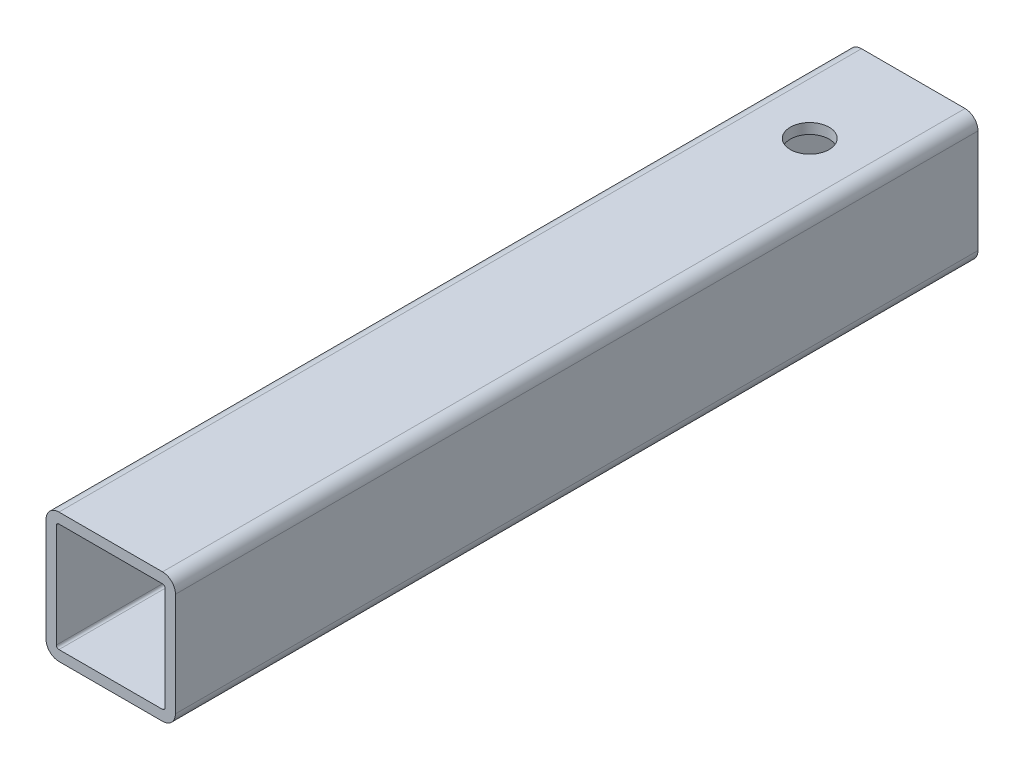
ISO-10303-21;
HEADER;
FILE_DESCRIPTION(('STEP AP214'),'2;1');
FILE_NAME('part.step','',(''),(''),'','','');
FILE_SCHEMA(('AUTOMOTIVE_DESIGN { 1 0 10303 214 1 1 1 1 }'));
ENDSEC;
DATA;
#1=APPLICATION_CONTEXT('core data for automotive mechanical design processes');
#2=APPLICATION_PROTOCOL_DEFINITION('international standard','automotive_design',2000,#1);
#3=PRODUCT_CONTEXT('',#1,'mechanical');
#4=PRODUCT('Part','Part','',(#3));
#5=PRODUCT_RELATED_PRODUCT_CATEGORY('part','',(#4));
#6=PRODUCT_DEFINITION_FORMATION('','',#4);
#7=PRODUCT_DEFINITION_CONTEXT('part definition',#1,'design');
#8=PRODUCT_DEFINITION('design','',#6,#7);
#9=PRODUCT_DEFINITION_SHAPE('','',#8);
#10=(LENGTH_UNIT() NAMED_UNIT(*) SI_UNIT(.MILLI.,.METRE.));
#11=(NAMED_UNIT(*) PLANE_ANGLE_UNIT() SI_UNIT($,.RADIAN.));
#12=(NAMED_UNIT(*) SI_UNIT($,.STERADIAN.) SOLID_ANGLE_UNIT());
#13=UNCERTAINTY_MEASURE_WITH_UNIT(LENGTH_MEASURE(1.E-05),#10,'distance_accuracy_value','');
#14=(GEOMETRIC_REPRESENTATION_CONTEXT(3) GLOBAL_UNCERTAINTY_ASSIGNED_CONTEXT((#13)) GLOBAL_UNIT_ASSIGNED_CONTEXT((#10,
#11,#12)) REPRESENTATION_CONTEXT('',''));
#15=CARTESIAN_POINT('',(0.,0.,0.));
#16=DIRECTION('',(0.,0.,1.));
#17=DIRECTION('',(1.,0.,0.));
#18=AXIS2_PLACEMENT_3D('',#15,#16,#17);
#19=CARTESIAN_POINT('',(20.,-20.,155.));
#20=DIRECTION('',(0.,0.,-1.));
#21=DIRECTION('',(-1.,0.,0.));
#22=AXIS2_PLACEMENT_3D('',#19,#20,#21);
#23=CYLINDRICAL_SURFACE('',#22,5.00000000000001);
#24=CARTESIAN_POINT('',(20.,-20.,-155.));
#25=DIRECTION('',(0.,0.,1.));
#26=DIRECTION('',(1.,0.,0.));
#27=AXIS2_PLACEMENT_3D('',#24,#25,#26);
#28=CIRCLE('',#27,5.00000000000001);
#29=CARTESIAN_POINT('',(20.,-25.,-155.));
#30=VERTEX_POINT('',#29);
#31=CARTESIAN_POINT('',(25.,-20.,-155.));
#32=VERTEX_POINT('',#31);
#33=EDGE_CURVE('E238',#30,#32,#28,.T.);
#34=ORIENTED_EDGE('',*,*,#33,.T.);
#35=DIRECTION('',(0.,0.,-1.));
#36=VECTOR('',#35,1.);
#37=CARTESIAN_POINT('',(25.,-20.,155.));
#38=LINE('',#37,#36);
#39=CARTESIAN_POINT('',(25.,-20.,155.));
#40=VERTEX_POINT('',#39);
#41=EDGE_CURVE('E12',#40,#32,#38,.T.);
#42=ORIENTED_EDGE('',*,*,#41,.F.);
#43=CARTESIAN_POINT('',(20.,-20.,155.));
#44=DIRECTION('',(0.,0.,1.));
#45=DIRECTION('',(1.,0.,0.));
#46=AXIS2_PLACEMENT_3D('',#43,#44,#45);
#47=CIRCLE('',#46,5.00000000000001);
#48=CARTESIAN_POINT('',(20.,-25.,155.));
#49=VERTEX_POINT('',#48);
#50=EDGE_CURVE('E316',#49,#40,#47,.T.);
#51=ORIENTED_EDGE('',*,*,#50,.F.);
#52=DIRECTION('',(0.,0.,-1.));
#53=VECTOR('',#52,1.);
#54=CARTESIAN_POINT('',(20.,-25.,155.));
#55=LINE('',#54,#53);
#56=EDGE_CURVE('E253',#49,#30,#55,.T.);
#57=ORIENTED_EDGE('',*,*,#56,.T.);
#58=EDGE_LOOP('',(#34,#42,#51,#57));
#59=FACE_BOUND('',#58,.T.);
#60=ADVANCED_FACE('F65',(#59),#23,.T.);
#61=CARTESIAN_POINT('',(25.,-20.,155.));
#62=DIRECTION('',(-1.,0.,0.));
#63=DIRECTION('',(0.,-1.,0.));
#64=AXIS2_PLACEMENT_3D('',#61,#62,#63);
#65=PLANE('',#64);
#66=DIRECTION('',(0.,1.,0.));
#67=VECTOR('',#66,1.);
#68=CARTESIAN_POINT('',(25.,-20.,-155.));
#69=LINE('',#68,#67);
#70=CARTESIAN_POINT('',(25.,20.,-155.));
#71=VERTEX_POINT('',#70);
#72=EDGE_CURVE('E241',#32,#71,#69,.T.);
#73=ORIENTED_EDGE('',*,*,#72,.T.);
#74=DIRECTION('',(0.,0.,-1.));
#75=VECTOR('',#74,1.);
#76=CARTESIAN_POINT('',(25.,20.,155.));
#77=LINE('',#76,#75);
#78=CARTESIAN_POINT('',(25.,20.,155.));
#79=VERTEX_POINT('',#78);
#80=EDGE_CURVE('E75',#79,#71,#77,.T.);
#81=ORIENTED_EDGE('',*,*,#80,.F.);
#82=DIRECTION('',(0.,1.,0.));
#83=VECTOR('',#82,1.);
#84=CARTESIAN_POINT('',(25.,-20.,155.));
#85=LINE('',#84,#83);
#86=EDGE_CURVE('E318',#40,#79,#85,.T.);
#87=ORIENTED_EDGE('',*,*,#86,.F.);
#88=ORIENTED_EDGE('',*,*,#41,.T.);
#89=EDGE_LOOP('',(#73,#81,#87,#88));
#90=FACE_BOUND('',#89,.T.);
#91=ADVANCED_FACE('F355',(#90),#65,.F.);
#92=CARTESIAN_POINT('',(20.,20.,155.));
#93=DIRECTION('',(0.,0.,-1.));
#94=DIRECTION('',(-1.,0.,0.));
#95=AXIS2_PLACEMENT_3D('',#92,#93,#94);
#96=CYLINDRICAL_SURFACE('',#95,5.00000000000001);
#97=CARTESIAN_POINT('',(20.,20.,-155.));
#98=DIRECTION('',(0.,0.,1.));
#99=DIRECTION('',(1.,0.,0.));
#100=AXIS2_PLACEMENT_3D('',#97,#98,#99);
#101=CIRCLE('',#100,5.00000000000001);
#102=CARTESIAN_POINT('',(20.,25.,-155.));
#103=VERTEX_POINT('',#102);
#104=EDGE_CURVE('E243',#71,#103,#101,.T.);
#105=ORIENTED_EDGE('',*,*,#104,.T.);
#106=DIRECTION('',(0.,0.,-1.));
#107=VECTOR('',#106,1.);
#108=CARTESIAN_POINT('',(20.,25.,155.));
#109=LINE('',#108,#107);
#110=CARTESIAN_POINT('',(20.,25.,155.));
#111=VERTEX_POINT('',#110);
#112=EDGE_CURVE('E260',#111,#103,#109,.T.);
#113=ORIENTED_EDGE('',*,*,#112,.F.);
#114=CARTESIAN_POINT('',(20.,20.,155.));
#115=DIRECTION('',(0.,0.,1.));
#116=DIRECTION('',(1.,0.,0.));
#117=AXIS2_PLACEMENT_3D('',#114,#115,#116);
#118=CIRCLE('',#117,5.00000000000001);
#119=EDGE_CURVE('E320',#79,#111,#118,.T.);
#120=ORIENTED_EDGE('',*,*,#119,.F.);
#121=ORIENTED_EDGE('',*,*,#80,.T.);
#122=EDGE_LOOP('',(#105,#113,#120,#121));
#123=FACE_BOUND('',#122,.T.);
#124=ADVANCED_FACE('F360',(#123),#96,.T.);
#125=CARTESIAN_POINT('',(-20.,25.,155.));
#126=DIRECTION('',(0.,-1.,0.));
#127=DIRECTION('',(1.,0.,0.));
#128=AXIS2_PLACEMENT_3D('',#125,#126,#127);
#129=PLANE('',#128);
#130=CARTESIAN_POINT('',(0.,25.,-115.));
#131=DIRECTION('',(0.,1.,0.));
#132=DIRECTION('',(-1.,0.,0.));
#133=AXIS2_PLACEMENT_3D('',#130,#131,#132);
#134=CIRCLE('',#133,7.50000000000001);
#135=CARTESIAN_POINT('',(-7.50000000000001,25.,-115.));
#136=VERTEX_POINT('',#135);
#137=EDGE_CURVE('E599',#136,#136,#134,.T.);
#138=ORIENTED_EDGE('',*,*,#137,.F.);
#139=EDGE_LOOP('',(#138));
#140=FACE_BOUND('',#139,.T.);
#141=DIRECTION('',(-1.,0.,0.));
#142=VECTOR('',#141,1.);
#143=CARTESIAN_POINT('',(-20.,25.,-155.));
#144=LINE('',#143,#142);
#145=CARTESIAN_POINT('',(-20.,25.,-155.));
#146=VERTEX_POINT('',#145);
#147=EDGE_CURVE('E245',#103,#146,#144,.T.);
#148=ORIENTED_EDGE('',*,*,#147,.T.);
#149=DIRECTION('',(0.,0.,-1.));
#150=VECTOR('',#149,1.);
#151=CARTESIAN_POINT('',(-20.,25.,155.));
#152=LINE('',#151,#150);
#153=CARTESIAN_POINT('',(-20.,25.,155.));
#154=VERTEX_POINT('',#153);
#155=EDGE_CURVE('E257',#154,#146,#152,.T.);
#156=ORIENTED_EDGE('',*,*,#155,.F.);
#157=DIRECTION('',(-1.,0.,0.));
#158=VECTOR('',#157,1.);
#159=CARTESIAN_POINT('',(-20.,25.,155.));
#160=LINE('',#159,#158);
#161=EDGE_CURVE('E322',#111,#154,#160,.T.);
#162=ORIENTED_EDGE('',*,*,#161,.F.);
#163=ORIENTED_EDGE('',*,*,#112,.T.);
#164=EDGE_LOOP('',(#148,#156,#162,#163));
#165=FACE_BOUND('',#164,.T.);
#166=ADVANCED_FACE('F328',(#140,#165),#129,.F.);
#167=CARTESIAN_POINT('',(-20.,20.,155.));
#168=DIRECTION('',(0.,0.,-1.));
#169=DIRECTION('',(-1.,0.,0.));
#170=AXIS2_PLACEMENT_3D('',#167,#168,#169);
#171=CYLINDRICAL_SURFACE('',#170,5.00000000000001);
#172=CARTESIAN_POINT('',(-20.,20.,-155.));
#173=DIRECTION('',(0.,0.,1.));
#174=DIRECTION('',(1.,0.,0.));
#175=AXIS2_PLACEMENT_3D('',#172,#173,#174);
#176=CIRCLE('',#175,5.00000000000001);
#177=CARTESIAN_POINT('',(-25.,20.,-155.));
#178=VERTEX_POINT('',#177);
#179=EDGE_CURVE('E247',#146,#178,#176,.T.);
#180=ORIENTED_EDGE('',*,*,#179,.T.);
#181=DIRECTION('',(0.,0.,-1.));
#182=VECTOR('',#181,1.);
#183=CARTESIAN_POINT('',(-25.,20.,155.));
#184=LINE('',#183,#182);
#185=CARTESIAN_POINT('',(-25.,20.,155.));
#186=VERTEX_POINT('',#185);
#187=EDGE_CURVE('E204',#186,#178,#184,.T.);
#188=ORIENTED_EDGE('',*,*,#187,.F.);
#189=CARTESIAN_POINT('',(-20.,20.,155.));
#190=DIRECTION('',(0.,0.,1.));
#191=DIRECTION('',(1.,0.,0.));
#192=AXIS2_PLACEMENT_3D('',#189,#190,#191);
#193=CIRCLE('',#192,5.00000000000001);
#194=EDGE_CURVE('E195',#154,#186,#193,.T.);
#195=ORIENTED_EDGE('',*,*,#194,.F.);
#196=ORIENTED_EDGE('',*,*,#155,.T.);
#197=EDGE_LOOP('',(#180,#188,#195,#196));
#198=FACE_BOUND('',#197,.T.);
#199=ADVANCED_FACE('F332',(#198),#171,.T.);
#200=CARTESIAN_POINT('',(-25.,20.,155.));
#201=DIRECTION('',(1.,0.,0.));
#202=DIRECTION('',(0.,1.,0.));
#203=AXIS2_PLACEMENT_3D('',#200,#201,#202);
#204=PLANE('',#203);
#205=DIRECTION('',(0.,-1.,0.));
#206=VECTOR('',#205,1.);
#207=CARTESIAN_POINT('',(-25.,20.,-155.));
#208=LINE('',#207,#206);
#209=CARTESIAN_POINT('',(-25.,-20.,-155.));
#210=VERTEX_POINT('',#209);
#211=EDGE_CURVE('E203',#178,#210,#208,.T.);
#212=ORIENTED_EDGE('',*,*,#211,.T.);
#213=DIRECTION('',(0.,0.,-1.));
#214=VECTOR('',#213,1.);
#215=CARTESIAN_POINT('',(-25.,-20.,155.));
#216=LINE('',#215,#214);
#217=CARTESIAN_POINT('',(-25.,-20.,155.));
#218=VERTEX_POINT('',#217);
#219=EDGE_CURVE('E200',#218,#210,#216,.T.);
#220=ORIENTED_EDGE('',*,*,#219,.F.);
#221=DIRECTION('',(0.,-1.,0.));
#222=VECTOR('',#221,1.);
#223=CARTESIAN_POINT('',(-25.,20.,155.));
#224=LINE('',#223,#222);
#225=EDGE_CURVE('E189',#186,#218,#224,.T.);
#226=ORIENTED_EDGE('',*,*,#225,.F.);
#227=ORIENTED_EDGE('',*,*,#187,.T.);
#228=EDGE_LOOP('',(#212,#220,#226,#227));
#229=FACE_BOUND('',#228,.T.);
#230=ADVANCED_FACE('F201',(#229),#204,.F.);
#231=CARTESIAN_POINT('',(-20.,-20.,155.));
#232=DIRECTION('',(0.,0.,-1.));
#233=DIRECTION('',(-1.,0.,0.));
#234=AXIS2_PLACEMENT_3D('',#231,#232,#233);
#235=CYLINDRICAL_SURFACE('',#234,5.00000000000001);
#236=CARTESIAN_POINT('',(-20.,-20.,-155.));
#237=DIRECTION('',(0.,0.,1.));
#238=DIRECTION('',(1.,0.,0.));
#239=AXIS2_PLACEMENT_3D('',#236,#237,#238);
#240=CIRCLE('',#239,5.00000000000001);
#241=CARTESIAN_POINT('',(-20.,-25.,-155.));
#242=VERTEX_POINT('',#241);
#243=EDGE_CURVE('E137',#210,#242,#240,.T.);
#244=ORIENTED_EDGE('',*,*,#243,.T.);
#245=DIRECTION('',(0.,0.,-1.));
#246=VECTOR('',#245,1.);
#247=CARTESIAN_POINT('',(-20.,-25.,155.));
#248=LINE('',#247,#246);
#249=CARTESIAN_POINT('',(-20.,-25.,155.));
#250=VERTEX_POINT('',#249);
#251=EDGE_CURVE('E205',#250,#242,#248,.T.);
#252=ORIENTED_EDGE('',*,*,#251,.F.);
#253=CARTESIAN_POINT('',(-20.,-20.,155.));
#254=DIRECTION('',(0.,0.,1.));
#255=DIRECTION('',(1.,0.,0.));
#256=AXIS2_PLACEMENT_3D('',#253,#254,#255);
#257=CIRCLE('',#256,5.00000000000001);
#258=EDGE_CURVE('E193',#218,#250,#257,.T.);
#259=ORIENTED_EDGE('',*,*,#258,.F.);
#260=ORIENTED_EDGE('',*,*,#219,.T.);
#261=EDGE_LOOP('',(#244,#252,#259,#260));
#262=FACE_BOUND('',#261,.T.);
#263=ADVANCED_FACE('F207',(#262),#235,.T.);
#264=CARTESIAN_POINT('',(20.,20.,155.));
#265=DIRECTION('',(0.,0.,-1.));
#266=DIRECTION('',(-1.,0.,0.));
#267=AXIS2_PLACEMENT_3D('',#264,#265,#266);
#268=CYLINDRICAL_SURFACE('',#267,1.00000000000001);
#269=CARTESIAN_POINT('',(20.,20.,-155.));
#270=DIRECTION('',(0.,0.,1.));
#271=DIRECTION('',(1.,0.,0.));
#272=AXIS2_PLACEMENT_3D('',#269,#270,#271);
#273=CIRCLE('',#272,1.00000000000001);
#274=CARTESIAN_POINT('',(21.,20.,-155.));
#275=VERTEX_POINT('',#274);
#276=CARTESIAN_POINT('',(20.,21.,-155.));
#277=VERTEX_POINT('',#276);
#278=EDGE_CURVE('E213',#275,#277,#273,.T.);
#279=ORIENTED_EDGE('',*,*,#278,.F.);
#280=DIRECTION('',(0.,0.,-1.));
#281=VECTOR('',#280,1.);
#282=CARTESIAN_POINT('',(21.,20.,155.));
#283=LINE('',#282,#281);
#284=CARTESIAN_POINT('',(21.,20.,155.));
#285=VERTEX_POINT('',#284);
#286=EDGE_CURVE('E69',#285,#275,#283,.T.);
#287=ORIENTED_EDGE('',*,*,#286,.F.);
#288=CARTESIAN_POINT('',(20.,20.,155.));
#289=DIRECTION('',(0.,0.,1.));
#290=DIRECTION('',(1.,0.,0.));
#291=AXIS2_PLACEMENT_3D('',#288,#289,#290);
#292=CIRCLE('',#291,1.00000000000001);
#293=CARTESIAN_POINT('',(20.,21.,155.));
#294=VERTEX_POINT('',#293);
#295=EDGE_CURVE('E252',#285,#294,#292,.T.);
#296=ORIENTED_EDGE('',*,*,#295,.T.);
#297=DIRECTION('',(0.,0.,-1.));
#298=VECTOR('',#297,1.);
#299=CARTESIAN_POINT('',(20.,21.,155.));
#300=LINE('',#299,#298);
#301=EDGE_CURVE('E209',#294,#277,#300,.T.);
#302=ORIENTED_EDGE('',*,*,#301,.T.);
#303=EDGE_LOOP('',(#279,#287,#296,#302));
#304=FACE_BOUND('',#303,.T.);
#305=ADVANCED_FACE('F67',(#304),#268,.F.);
#306=CARTESIAN_POINT('',(21.,-20.,155.));
#307=DIRECTION('',(-1.,0.,0.));
#308=DIRECTION('',(0.,-1.,0.));
#309=AXIS2_PLACEMENT_3D('',#306,#307,#308);
#310=PLANE('',#309);
#311=DIRECTION('',(0.,1.,0.));
#312=VECTOR('',#311,1.);
#313=CARTESIAN_POINT('',(21.,-20.,-155.));
#314=LINE('',#313,#312);
#315=CARTESIAN_POINT('',(21.,-20.,-155.));
#316=VERTEX_POINT('',#315);
#317=EDGE_CURVE('E216',#316,#275,#314,.T.);
#318=ORIENTED_EDGE('',*,*,#317,.F.);
#319=DIRECTION('',(0.,0.,-1.));
#320=VECTOR('',#319,1.);
#321=CARTESIAN_POINT('',(21.,-20.,155.));
#322=LINE('',#321,#320);
#323=CARTESIAN_POINT('',(21.,-20.,155.));
#324=VERTEX_POINT('',#323);
#325=EDGE_CURVE('E275',#324,#316,#322,.T.);
#326=ORIENTED_EDGE('',*,*,#325,.F.);
#327=DIRECTION('',(0.,1.,0.));
#328=VECTOR('',#327,1.);
#329=CARTESIAN_POINT('',(21.,-20.,155.));
#330=LINE('',#329,#328);
#331=EDGE_CURVE('E284',#324,#285,#330,.T.);
#332=ORIENTED_EDGE('',*,*,#331,.T.);
#333=ORIENTED_EDGE('',*,*,#286,.T.);
#334=EDGE_LOOP('',(#318,#326,#332,#333));
#335=FACE_BOUND('',#334,.T.);
#336=ADVANCED_FACE('F282',(#335),#310,.T.);
#337=CARTESIAN_POINT('',(20.,-20.,155.));
#338=DIRECTION('',(0.,0.,-1.));
#339=DIRECTION('',(-1.,0.,0.));
#340=AXIS2_PLACEMENT_3D('',#337,#338,#339);
#341=CYLINDRICAL_SURFACE('',#340,1.00000000000001);
#342=CARTESIAN_POINT('',(20.,-20.,-155.));
#343=DIRECTION('',(0.,0.,1.));
#344=DIRECTION('',(1.,0.,0.));
#345=AXIS2_PLACEMENT_3D('',#342,#343,#344);
#346=CIRCLE('',#345,1.00000000000001);
#347=CARTESIAN_POINT('',(20.,-21.,-155.));
#348=VERTEX_POINT('',#347);
#349=EDGE_CURVE('E220',#348,#316,#346,.T.);
#350=ORIENTED_EDGE('',*,*,#349,.F.);
#351=DIRECTION('',(0.,0.,-1.));
#352=VECTOR('',#351,1.);
#353=CARTESIAN_POINT('',(20.,-21.,155.));
#354=LINE('',#353,#352);
#355=CARTESIAN_POINT('',(20.,-21.,155.));
#356=VERTEX_POINT('',#355);
#357=EDGE_CURVE('E274',#356,#348,#354,.T.);
#358=ORIENTED_EDGE('',*,*,#357,.F.);
#359=CARTESIAN_POINT('',(20.,-20.,155.));
#360=DIRECTION('',(0.,0.,1.));
#361=DIRECTION('',(1.,0.,0.));
#362=AXIS2_PLACEMENT_3D('',#359,#360,#361);
#363=CIRCLE('',#362,1.00000000000001);
#364=EDGE_CURVE('E292',#356,#324,#363,.T.);
#365=ORIENTED_EDGE('',*,*,#364,.T.);
#366=ORIENTED_EDGE('',*,*,#325,.T.);
#367=EDGE_LOOP('',(#350,#358,#365,#366));
#368=FACE_BOUND('',#367,.T.);
#369=ADVANCED_FACE('F290',(#368),#341,.F.);
#370=CARTESIAN_POINT('',(20.,-21.,155.));
#371=DIRECTION('',(0.,1.,0.));
#372=DIRECTION('',(0.,0.,1.));
#373=AXIS2_PLACEMENT_3D('',#370,#371,#372);
#374=PLANE('',#373);
#375=CARTESIAN_POINT('',(0.,-21.,-115.));
#376=DIRECTION('',(0.,1.,0.));
#377=DIRECTION('',(0.,0.,1.));
#378=AXIS2_PLACEMENT_3D('',#375,#376,#377);
#379=CIRCLE('',#378,7.50000000000001);
#380=CARTESIAN_POINT('',(0.,-21.,-107.5));
#381=VERTEX_POINT('',#380);
#382=EDGE_CURVE('E217',#381,#381,#379,.T.);
#383=ORIENTED_EDGE('',*,*,#382,.F.);
#384=EDGE_LOOP('',(#383));
#385=FACE_BOUND('',#384,.T.);
#386=DIRECTION('',(1.,0.,0.));
#387=VECTOR('',#386,1.);
#388=CARTESIAN_POINT('',(20.,-21.,-155.));
#389=LINE('',#388,#387);
#390=CARTESIAN_POINT('',(-20.,-21.,-155.));
#391=VERTEX_POINT('',#390);
#392=EDGE_CURVE('E223',#391,#348,#389,.T.);
#393=ORIENTED_EDGE('',*,*,#392,.F.);
#394=DIRECTION('',(0.,0.,-1.));
#395=VECTOR('',#394,1.);
#396=CARTESIAN_POINT('',(-20.,-21.,155.));
#397=LINE('',#396,#395);
#398=CARTESIAN_POINT('',(-20.,-21.,155.));
#399=VERTEX_POINT('',#398);
#400=EDGE_CURVE('E272',#399,#391,#397,.T.);
#401=ORIENTED_EDGE('',*,*,#400,.F.);
#402=DIRECTION('',(1.,0.,0.));
#403=VECTOR('',#402,1.);
#404=CARTESIAN_POINT('',(20.,-21.,155.));
#405=LINE('',#404,#403);
#406=EDGE_CURVE('E298',#399,#356,#405,.T.);
#407=ORIENTED_EDGE('',*,*,#406,.T.);
#408=ORIENTED_EDGE('',*,*,#357,.T.);
#409=EDGE_LOOP('',(#393,#401,#407,#408));
#410=FACE_BOUND('',#409,.T.);
#411=ADVANCED_FACE('F301',(#385,#410),#374,.T.);
#412=CARTESIAN_POINT('',(-20.,-20.,155.));
#413=DIRECTION('',(0.,0.,-1.));
#414=DIRECTION('',(-1.,0.,0.));
#415=AXIS2_PLACEMENT_3D('',#412,#413,#414);
#416=CYLINDRICAL_SURFACE('',#415,1.00000000000001);
#417=CARTESIAN_POINT('',(-20.,-20.,-155.));
#418=DIRECTION('',(0.,0.,1.));
#419=DIRECTION('',(1.,0.,0.));
#420=AXIS2_PLACEMENT_3D('',#417,#418,#419);
#421=CIRCLE('',#420,1.00000000000001);
#422=CARTESIAN_POINT('',(-21.,-20.,-155.));
#423=VERTEX_POINT('',#422);
#424=EDGE_CURVE('E226',#423,#391,#421,.T.);
#425=ORIENTED_EDGE('',*,*,#424,.F.);
#426=DIRECTION('',(0.,0.,-1.));
#427=VECTOR('',#426,1.);
#428=CARTESIAN_POINT('',(-21.,-20.,155.));
#429=LINE('',#428,#427);
#430=CARTESIAN_POINT('',(-21.,-20.,155.));
#431=VERTEX_POINT('',#430);
#432=EDGE_CURVE('E270',#431,#423,#429,.T.);
#433=ORIENTED_EDGE('',*,*,#432,.F.);
#434=CARTESIAN_POINT('',(-20.,-20.,155.));
#435=DIRECTION('',(0.,0.,1.));
#436=DIRECTION('',(1.,0.,0.));
#437=AXIS2_PLACEMENT_3D('',#434,#435,#436);
#438=CIRCLE('',#437,1.00000000000001);
#439=EDGE_CURVE('E302',#431,#399,#438,.T.);
#440=ORIENTED_EDGE('',*,*,#439,.T.);
#441=ORIENTED_EDGE('',*,*,#400,.T.);
#442=EDGE_LOOP('',(#425,#433,#440,#441));
#443=FACE_BOUND('',#442,.T.);
#444=ADVANCED_FACE('F371',(#443),#416,.F.);
#445=CARTESIAN_POINT('',(-21.,20.,155.));
#446=DIRECTION('',(1.,0.,0.));
#447=DIRECTION('',(0.,1.,0.));
#448=AXIS2_PLACEMENT_3D('',#445,#446,#447);
#449=PLANE('',#448);
#450=DIRECTION('',(0.,-1.,0.));
#451=VECTOR('',#450,1.);
#452=CARTESIAN_POINT('',(-21.,20.,-155.));
#453=LINE('',#452,#451);
#454=CARTESIAN_POINT('',(-21.,20.,-155.));
#455=VERTEX_POINT('',#454);
#456=EDGE_CURVE('E229',#455,#423,#453,.T.);
#457=ORIENTED_EDGE('',*,*,#456,.F.);
#458=DIRECTION('',(0.,0.,-1.));
#459=VECTOR('',#458,1.);
#460=CARTESIAN_POINT('',(-21.,20.,155.));
#461=LINE('',#460,#459);
#462=CARTESIAN_POINT('',(-21.,20.,155.));
#463=VERTEX_POINT('',#462);
#464=EDGE_CURVE('E268',#463,#455,#461,.T.);
#465=ORIENTED_EDGE('',*,*,#464,.F.);
#466=DIRECTION('',(0.,-1.,0.));
#467=VECTOR('',#466,1.);
#468=CARTESIAN_POINT('',(-21.,20.,155.));
#469=LINE('',#468,#467);
#470=EDGE_CURVE('E304',#463,#431,#469,.T.);
#471=ORIENTED_EDGE('',*,*,#470,.T.);
#472=ORIENTED_EDGE('',*,*,#432,.T.);
#473=EDGE_LOOP('',(#457,#465,#471,#472));
#474=FACE_BOUND('',#473,.T.);
#475=ADVANCED_FACE('F367',(#474),#449,.T.);
#476=CARTESIAN_POINT('',(-20.,20.,155.));
#477=DIRECTION('',(0.,0.,-1.));
#478=DIRECTION('',(-1.,0.,0.));
#479=AXIS2_PLACEMENT_3D('',#476,#477,#478);
#480=CYLINDRICAL_SURFACE('',#479,1.);
#481=CARTESIAN_POINT('',(-20.,20.,-155.));
#482=DIRECTION('',(0.,0.,1.));
#483=DIRECTION('',(1.,0.,0.));
#484=AXIS2_PLACEMENT_3D('',#481,#482,#483);
#485=CIRCLE('',#484,1.);
#486=CARTESIAN_POINT('',(-20.,21.,-155.));
#487=VERTEX_POINT('',#486);
#488=EDGE_CURVE('E232',#487,#455,#485,.T.);
#489=ORIENTED_EDGE('',*,*,#488,.F.);
#490=DIRECTION('',(0.,0.,-1.));
#491=VECTOR('',#490,1.);
#492=CARTESIAN_POINT('',(-20.,21.,155.));
#493=LINE('',#492,#491);
#494=CARTESIAN_POINT('',(-20.,21.,155.));
#495=VERTEX_POINT('',#494);
#496=EDGE_CURVE('E266',#495,#487,#493,.T.);
#497=ORIENTED_EDGE('',*,*,#496,.F.);
#498=CARTESIAN_POINT('',(-20.,20.,155.));
#499=DIRECTION('',(0.,0.,1.));
#500=DIRECTION('',(1.,0.,0.));
#501=AXIS2_PLACEMENT_3D('',#498,#499,#500);
#502=CIRCLE('',#501,1.);
#503=EDGE_CURVE('E310',#495,#463,#502,.T.);
#504=ORIENTED_EDGE('',*,*,#503,.T.);
#505=ORIENTED_EDGE('',*,*,#464,.T.);
#506=EDGE_LOOP('',(#489,#497,#504,#505));
#507=FACE_BOUND('',#506,.T.);
#508=ADVANCED_FACE('F348',(#507),#480,.F.);
#509=CARTESIAN_POINT('',(-20.,21.,155.));
#510=DIRECTION('',(0.,-1.,0.));
#511=DIRECTION('',(1.,0.,0.));
#512=AXIS2_PLACEMENT_3D('',#509,#510,#511);
#513=PLANE('',#512);
#514=CARTESIAN_POINT('',(0.,21.,-115.));
#515=DIRECTION('',(0.,-1.,0.));
#516=DIRECTION('',(1.,0.,0.));
#517=AXIS2_PLACEMENT_3D('',#514,#515,#516);
#518=CIRCLE('',#517,7.50000000000001);
#519=CARTESIAN_POINT('',(7.5,21.,-115.));
#520=VERTEX_POINT('',#519);
#521=EDGE_CURVE('E596',#520,#520,#518,.T.);
#522=ORIENTED_EDGE('',*,*,#521,.F.);
#523=EDGE_LOOP('',(#522));
#524=FACE_BOUND('',#523,.T.);
#525=DIRECTION('',(-1.,0.,0.));
#526=VECTOR('',#525,1.);
#527=CARTESIAN_POINT('',(-20.,21.,-155.));
#528=LINE('',#527,#526);
#529=EDGE_CURVE('E235',#277,#487,#528,.T.);
#530=ORIENTED_EDGE('',*,*,#529,.F.);
#531=ORIENTED_EDGE('',*,*,#301,.F.);
#532=DIRECTION('',(-1.,0.,0.));
#533=VECTOR('',#532,1.);
#534=CARTESIAN_POINT('',(-20.,21.,155.));
#535=LINE('',#534,#533);
#536=EDGE_CURVE('E313',#294,#495,#535,.T.);
#537=ORIENTED_EDGE('',*,*,#536,.T.);
#538=ORIENTED_EDGE('',*,*,#496,.T.);
#539=EDGE_LOOP('',(#530,#531,#537,#538));
#540=FACE_BOUND('',#539,.T.);
#541=ADVANCED_FACE('F340',(#524,#540),#513,.T.);
#542=CARTESIAN_POINT('',(20.,-25.,155.));
#543=DIRECTION('',(0.,1.,0.));
#544=DIRECTION('',(0.,0.,1.));
#545=AXIS2_PLACEMENT_3D('',#542,#543,#544);
#546=PLANE('',#545);
#547=CARTESIAN_POINT('',(0.,-25.,-115.));
#548=DIRECTION('',(0.,1.,0.));
#549=DIRECTION('',(-1.,0.,0.));
#550=AXIS2_PLACEMENT_3D('',#547,#548,#549);
#551=CIRCLE('',#550,7.50000000000001);
#552=CARTESIAN_POINT('',(-7.5,-25.,-115.));
#553=VERTEX_POINT('',#552);
#554=EDGE_CURVE('E600',#553,#553,#551,.T.);
#555=ORIENTED_EDGE('',*,*,#554,.T.);
#556=EDGE_LOOP('',(#555));
#557=FACE_BOUND('',#556,.T.);
#558=DIRECTION('',(1.,0.,0.));
#559=VECTOR('',#558,1.);
#560=CARTESIAN_POINT('',(20.,-25.,-155.));
#561=LINE('',#560,#559);
#562=EDGE_CURVE('E143',#242,#30,#561,.T.);
#563=ORIENTED_EDGE('',*,*,#562,.T.);
#564=ORIENTED_EDGE('',*,*,#56,.F.);
#565=DIRECTION('',(1.,0.,0.));
#566=VECTOR('',#565,1.);
#567=CARTESIAN_POINT('',(20.,-25.,155.));
#568=LINE('',#567,#566);
#569=EDGE_CURVE('E84',#250,#49,#568,.T.);
#570=ORIENTED_EDGE('',*,*,#569,.F.);
#571=ORIENTED_EDGE('',*,*,#251,.T.);
#572=EDGE_LOOP('',(#563,#564,#570,#571));
#573=FACE_BOUND('',#572,.T.);
#574=ADVANCED_FACE('F338',(#557,#573),#546,.F.);
#575=CARTESIAN_POINT('',(20.,-20.,155.));
#576=DIRECTION('',(0.,0.,1.));
#577=DIRECTION('',(1.,0.,0.));
#578=AXIS2_PLACEMENT_3D('',#575,#576,#577);
#579=PLANE('',#578);
#580=ORIENTED_EDGE('',*,*,#295,.F.);
#581=ORIENTED_EDGE('',*,*,#331,.F.);
#582=ORIENTED_EDGE('',*,*,#364,.F.);
#583=ORIENTED_EDGE('',*,*,#406,.F.);
#584=ORIENTED_EDGE('',*,*,#439,.F.);
#585=ORIENTED_EDGE('',*,*,#470,.F.);
#586=ORIENTED_EDGE('',*,*,#503,.F.);
#587=ORIENTED_EDGE('',*,*,#536,.F.);
#588=EDGE_LOOP('',(#580,#581,#582,#583,#584,#585,#586,#587));
#589=FACE_BOUND('',#588,.T.);
#590=ORIENTED_EDGE('',*,*,#50,.T.);
#591=ORIENTED_EDGE('',*,*,#86,.T.);
#592=ORIENTED_EDGE('',*,*,#119,.T.);
#593=ORIENTED_EDGE('',*,*,#161,.T.);
#594=ORIENTED_EDGE('',*,*,#194,.T.);
#595=ORIENTED_EDGE('',*,*,#225,.T.);
#596=ORIENTED_EDGE('',*,*,#258,.T.);
#597=ORIENTED_EDGE('',*,*,#569,.T.);
#598=EDGE_LOOP('',(#590,#591,#592,#593,#594,#595,#596,#597));
#599=FACE_BOUND('',#598,.T.);
#600=ADVANCED_FACE('F191',(#589,#599),#579,.T.);
#601=CARTESIAN_POINT('',(20.,-20.,-155.));
#602=DIRECTION('',(0.,0.,1.));
#603=DIRECTION('',(1.,0.,0.));
#604=AXIS2_PLACEMENT_3D('',#601,#602,#603);
#605=PLANE('',#604);
#606=ORIENTED_EDGE('',*,*,#278,.T.);
#607=ORIENTED_EDGE('',*,*,#529,.T.);
#608=ORIENTED_EDGE('',*,*,#488,.T.);
#609=ORIENTED_EDGE('',*,*,#456,.T.);
#610=ORIENTED_EDGE('',*,*,#424,.T.);
#611=ORIENTED_EDGE('',*,*,#392,.T.);
#612=ORIENTED_EDGE('',*,*,#349,.T.);
#613=ORIENTED_EDGE('',*,*,#317,.T.);
#614=EDGE_LOOP('',(#606,#607,#608,#609,#610,#611,#612,#613));
#615=FACE_BOUND('',#614,.T.);
#616=ORIENTED_EDGE('',*,*,#33,.F.);
#617=ORIENTED_EDGE('',*,*,#562,.F.);
#618=ORIENTED_EDGE('',*,*,#243,.F.);
#619=ORIENTED_EDGE('',*,*,#211,.F.);
#620=ORIENTED_EDGE('',*,*,#179,.F.);
#621=ORIENTED_EDGE('',*,*,#147,.F.);
#622=ORIENTED_EDGE('',*,*,#104,.F.);
#623=ORIENTED_EDGE('',*,*,#72,.F.);
#624=EDGE_LOOP('',(#616,#617,#618,#619,#620,#621,#622,#623));
#625=FACE_BOUND('',#624,.T.);
#626=ADVANCED_FACE('F287',(#615,#625),#605,.F.);
#627=CARTESIAN_POINT('',(0.,-25.,-115.));
#628=DIRECTION('',(0.,1.,0.));
#629=DIRECTION('',(-1.,0.,0.));
#630=AXIS2_PLACEMENT_3D('',#627,#628,#629);
#631=CYLINDRICAL_SURFACE('',#630,7.50000000000001);
#632=ORIENTED_EDGE('',*,*,#382,.T.);
#633=EDGE_LOOP('',(#632));
#634=FACE_BOUND('',#633,.T.);
#635=ORIENTED_EDGE('',*,*,#554,.F.);
#636=EDGE_LOOP('',(#635));
#637=FACE_BOUND('',#636,.T.);
#638=ADVANCED_FACE('F478',(#634,#637),#631,.F.);
#639=ORIENTED_EDGE('',*,*,#521,.T.);
#640=EDGE_LOOP('',(#639));
#641=FACE_BOUND('',#640,.T.);
#642=ORIENTED_EDGE('',*,*,#137,.T.);
#643=EDGE_LOOP('',(#642));
#644=FACE_BOUND('',#643,.T.);
#645=ADVANCED_FACE('F488',(#641,#644),#631,.F.);
#646=CLOSED_SHELL('',(#60,#91,#124,#166,#199,#230,#263,#305,#336,#369,#411,#444,#475,#508,#541,
#574,#600,#626,#638,#645));
#647=MANIFOLD_SOLID_BREP('B2',#646);
#648=ADVANCED_BREP_SHAPE_REPRESENTATION('',(#18,#647),#14);
#649=SHAPE_DEFINITION_REPRESENTATION(#9,#648);
ENDSEC;
END-ISO-10303-21;
